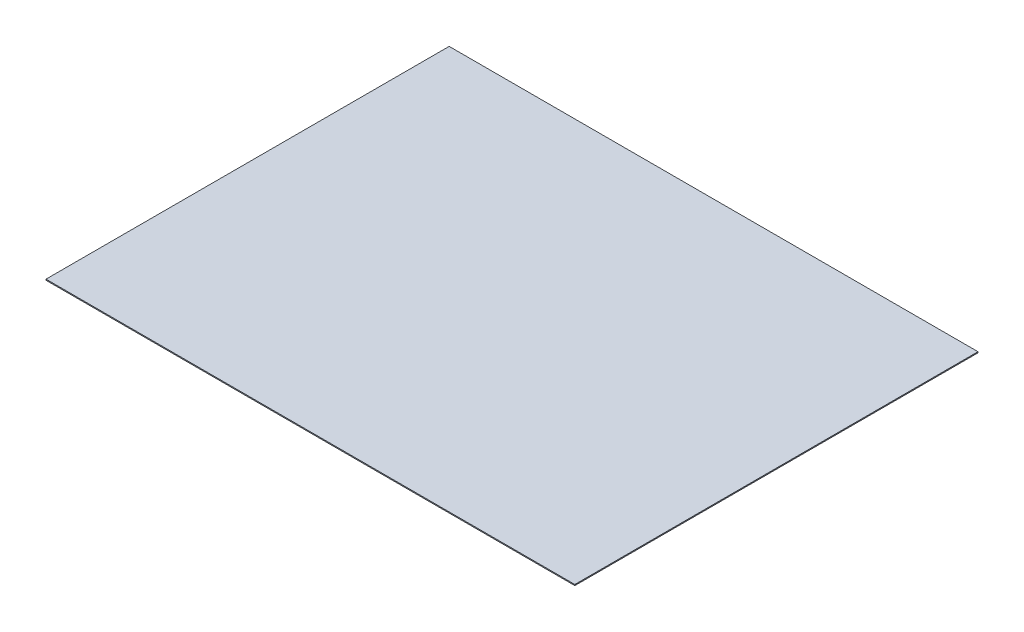
ISO-10303-21;
HEADER;
FILE_DESCRIPTION(('STEP AP214'),'2;1');
FILE_NAME('part.step','',(''),(''),'','','');
FILE_SCHEMA(('AUTOMOTIVE_DESIGN { 1 0 10303 214 1 1 1 1 }'));
ENDSEC;
DATA;
#1=APPLICATION_CONTEXT('core data for automotive mechanical design processes');
#2=APPLICATION_PROTOCOL_DEFINITION('international standard','automotive_design',2000,#1);
#3=PRODUCT_CONTEXT('',#1,'mechanical');
#4=PRODUCT('Part','Part','',(#3));
#5=PRODUCT_RELATED_PRODUCT_CATEGORY('part','',(#4));
#6=PRODUCT_DEFINITION_FORMATION('','',#4);
#7=PRODUCT_DEFINITION_CONTEXT('part definition',#1,'design');
#8=PRODUCT_DEFINITION('design','',#6,#7);
#9=PRODUCT_DEFINITION_SHAPE('','',#8);
#10=(LENGTH_UNIT() NAMED_UNIT(*) SI_UNIT(.MILLI.,.METRE.));
#11=(NAMED_UNIT(*) PLANE_ANGLE_UNIT() SI_UNIT($,.RADIAN.));
#12=(NAMED_UNIT(*) SI_UNIT($,.STERADIAN.) SOLID_ANGLE_UNIT());
#13=UNCERTAINTY_MEASURE_WITH_UNIT(LENGTH_MEASURE(1.E-05),#10,'distance_accuracy_value','');
#14=(GEOMETRIC_REPRESENTATION_CONTEXT(3) GLOBAL_UNCERTAINTY_ASSIGNED_CONTEXT((#13)) GLOBAL_UNIT_ASSIGNED_CONTEXT((#10,
#11,#12)) REPRESENTATION_CONTEXT('',''));
#15=CARTESIAN_POINT('',(0.,0.,0.));
#16=DIRECTION('',(0.,0.,1.));
#17=DIRECTION('',(1.,0.,0.));
#18=AXIS2_PLACEMENT_3D('',#15,#16,#17);
#19=CARTESIAN_POINT('',(0.,2.9,0.));
#20=DIRECTION('',(1.,0.,0.));
#21=DIRECTION('',(0.,0.,-1.));
#22=AXIS2_PLACEMENT_3D('',#19,#20,#21);
#23=PLANE('',#22);
#24=DIRECTION('',(0.,0.,1.));
#25=VECTOR('',#24,1.);
#26=CARTESIAN_POINT('',(0.,0.,0.));
#27=LINE('',#26,#25);
#28=CARTESIAN_POINT('',(0.,0.,0.));
#29=VERTEX_POINT('',#28);
#30=CARTESIAN_POINT('',(1.41838592277246E-13,0.,1158.2));
#31=VERTEX_POINT('',#30);
#32=EDGE_CURVE('E98',#29,#31,#27,.T.);
#33=ORIENTED_EDGE('',*,*,#32,.T.);
#34=DIRECTION('',(0.,-1.,0.));
#35=VECTOR('',#34,1.);
#36=CARTESIAN_POINT('',(1.41838592277246E-13,2.9,1158.2));
#37=LINE('',#36,#35);
#38=CARTESIAN_POINT('',(1.41838592277246E-13,2.9,1158.2));
#39=VERTEX_POINT('',#38);
#40=EDGE_CURVE('E11',#39,#31,#37,.T.);
#41=ORIENTED_EDGE('',*,*,#40,.F.);
#42=DIRECTION('',(0.,0.,1.));
#43=VECTOR('',#42,1.);
#44=CARTESIAN_POINT('',(0.,2.9,0.));
#45=LINE('',#44,#43);
#46=CARTESIAN_POINT('',(0.,2.9,0.));
#47=VERTEX_POINT('',#46);
#48=EDGE_CURVE('E86',#47,#39,#45,.T.);
#49=ORIENTED_EDGE('',*,*,#48,.F.);
#50=DIRECTION('',(0.,-1.,0.));
#51=VECTOR('',#50,1.);
#52=CARTESIAN_POINT('',(0.,2.9,0.));
#53=LINE('',#52,#51);
#54=EDGE_CURVE('E94',#47,#29,#53,.T.);
#55=ORIENTED_EDGE('',*,*,#54,.T.);
#56=EDGE_LOOP('',(#33,#41,#49,#55));
#57=FACE_BOUND('',#56,.T.);
#58=ADVANCED_FACE('F35',(#57),#23,.F.);
#59=CARTESIAN_POINT('',(1.41838592277246E-13,2.9,1158.2));
#60=DIRECTION('',(0.,0.,-1.));
#61=DIRECTION('',(-1.,0.,0.));
#62=AXIS2_PLACEMENT_3D('',#59,#60,#61);
#63=PLANE('',#62);
#64=DIRECTION('',(1.,0.,0.));
#65=VECTOR('',#64,1.);
#66=CARTESIAN_POINT('',(1.41838592277246E-13,0.,1158.2));
#67=LINE('',#66,#65);
#68=CARTESIAN_POINT('',(1519.3,0.,1158.2));
#69=VERTEX_POINT('',#68);
#70=EDGE_CURVE('E90',#31,#69,#67,.T.);
#71=ORIENTED_EDGE('',*,*,#70,.T.);
#72=DIRECTION('',(0.,-1.,0.));
#73=VECTOR('',#72,1.);
#74=CARTESIAN_POINT('',(1519.3,2.9,1158.2));
#75=LINE('',#74,#73);
#76=CARTESIAN_POINT('',(1519.3,2.9,1158.2));
#77=VERTEX_POINT('',#76);
#78=EDGE_CURVE('E43',#77,#69,#75,.T.);
#79=ORIENTED_EDGE('',*,*,#78,.F.);
#80=DIRECTION('',(1.,0.,0.));
#81=VECTOR('',#80,1.);
#82=CARTESIAN_POINT('',(1.41838592277246E-13,2.9,1158.2));
#83=LINE('',#82,#81);
#84=EDGE_CURVE('E81',#39,#77,#83,.T.);
#85=ORIENTED_EDGE('',*,*,#84,.F.);
#86=ORIENTED_EDGE('',*,*,#40,.T.);
#87=EDGE_LOOP('',(#71,#79,#85,#86));
#88=FACE_BOUND('',#87,.T.);
#89=ADVANCED_FACE('F89',(#88),#63,.F.);
#90=CARTESIAN_POINT('',(1519.3,2.9,0.));
#91=DIRECTION('',(-1.,0.,0.));
#92=DIRECTION('',(0.,0.,1.));
#93=AXIS2_PLACEMENT_3D('',#90,#91,#92);
#94=PLANE('',#93);
#95=DIRECTION('',(0.,0.,-1.));
#96=VECTOR('',#95,1.);
#97=CARTESIAN_POINT('',(1519.3,0.,0.));
#98=LINE('',#97,#96);
#99=CARTESIAN_POINT('',(1519.3,0.,0.));
#100=VERTEX_POINT('',#99);
#101=EDGE_CURVE('E68',#69,#100,#98,.T.);
#102=ORIENTED_EDGE('',*,*,#101,.T.);
#103=DIRECTION('',(0.,-1.,0.));
#104=VECTOR('',#103,1.);
#105=CARTESIAN_POINT('',(1519.3,2.9,0.));
#106=LINE('',#105,#104);
#107=CARTESIAN_POINT('',(1519.3,2.9,0.));
#108=VERTEX_POINT('',#107);
#109=EDGE_CURVE('E91',#108,#100,#106,.T.);
#110=ORIENTED_EDGE('',*,*,#109,.F.);
#111=DIRECTION('',(0.,0.,-1.));
#112=VECTOR('',#111,1.);
#113=CARTESIAN_POINT('',(1519.3,2.9,0.));
#114=LINE('',#113,#112);
#115=EDGE_CURVE('E84',#77,#108,#114,.T.);
#116=ORIENTED_EDGE('',*,*,#115,.F.);
#117=ORIENTED_EDGE('',*,*,#78,.T.);
#118=EDGE_LOOP('',(#102,#110,#116,#117));
#119=FACE_BOUND('',#118,.T.);
#120=ADVANCED_FACE('F92',(#119),#94,.F.);
#121=CARTESIAN_POINT('',(0.,2.9,0.));
#122=DIRECTION('',(0.,0.,1.));
#123=DIRECTION('',(1.,0.,0.));
#124=AXIS2_PLACEMENT_3D('',#121,#122,#123);
#125=PLANE('',#124);
#126=DIRECTION('',(-1.,0.,0.));
#127=VECTOR('',#126,1.);
#128=CARTESIAN_POINT('',(0.,0.,0.));
#129=LINE('',#128,#127);
#130=EDGE_CURVE('E74',#100,#29,#129,.T.);
#131=ORIENTED_EDGE('',*,*,#130,.T.);
#132=ORIENTED_EDGE('',*,*,#54,.F.);
#133=DIRECTION('',(-1.,0.,0.));
#134=VECTOR('',#133,1.);
#135=CARTESIAN_POINT('',(0.,2.9,0.));
#136=LINE('',#135,#134);
#137=EDGE_CURVE('E51',#108,#47,#136,.T.);
#138=ORIENTED_EDGE('',*,*,#137,.F.);
#139=ORIENTED_EDGE('',*,*,#109,.T.);
#140=EDGE_LOOP('',(#131,#132,#138,#139));
#141=FACE_BOUND('',#140,.T.);
#142=ADVANCED_FACE('F105',(#141),#125,.F.);
#143=CARTESIAN_POINT('',(0.,2.9,0.));
#144=DIRECTION('',(0.,1.,0.));
#145=DIRECTION('',(0.,0.,1.));
#146=AXIS2_PLACEMENT_3D('',#143,#144,#145);
#147=PLANE('',#146);
#148=ORIENTED_EDGE('',*,*,#48,.T.);
#149=ORIENTED_EDGE('',*,*,#84,.T.);
#150=ORIENTED_EDGE('',*,*,#115,.T.);
#151=ORIENTED_EDGE('',*,*,#137,.T.);
#152=EDGE_LOOP('',(#148,#149,#150,#151));
#153=FACE_BOUND('',#152,.T.);
#154=ADVANCED_FACE('F82',(#153),#147,.T.);
#155=CARTESIAN_POINT('',(0.,0.,0.));
#156=DIRECTION('',(0.,1.,0.));
#157=DIRECTION('',(0.,0.,1.));
#158=AXIS2_PLACEMENT_3D('',#155,#156,#157);
#159=PLANE('',#158);
#160=ORIENTED_EDGE('',*,*,#32,.F.);
#161=ORIENTED_EDGE('',*,*,#130,.F.);
#162=ORIENTED_EDGE('',*,*,#101,.F.);
#163=ORIENTED_EDGE('',*,*,#70,.F.);
#164=EDGE_LOOP('',(#160,#161,#162,#163));
#165=FACE_BOUND('',#164,.T.);
#166=ADVANCED_FACE('F108',(#165),#159,.F.);
#167=CLOSED_SHELL('',(#58,#89,#120,#142,#154,#166));
#168=MANIFOLD_SOLID_BREP('B2',#167);
#169=ADVANCED_BREP_SHAPE_REPRESENTATION('',(#18,#168),#14);
#170=SHAPE_DEFINITION_REPRESENTATION(#9,#169);
ENDSEC;
END-ISO-10303-21;
